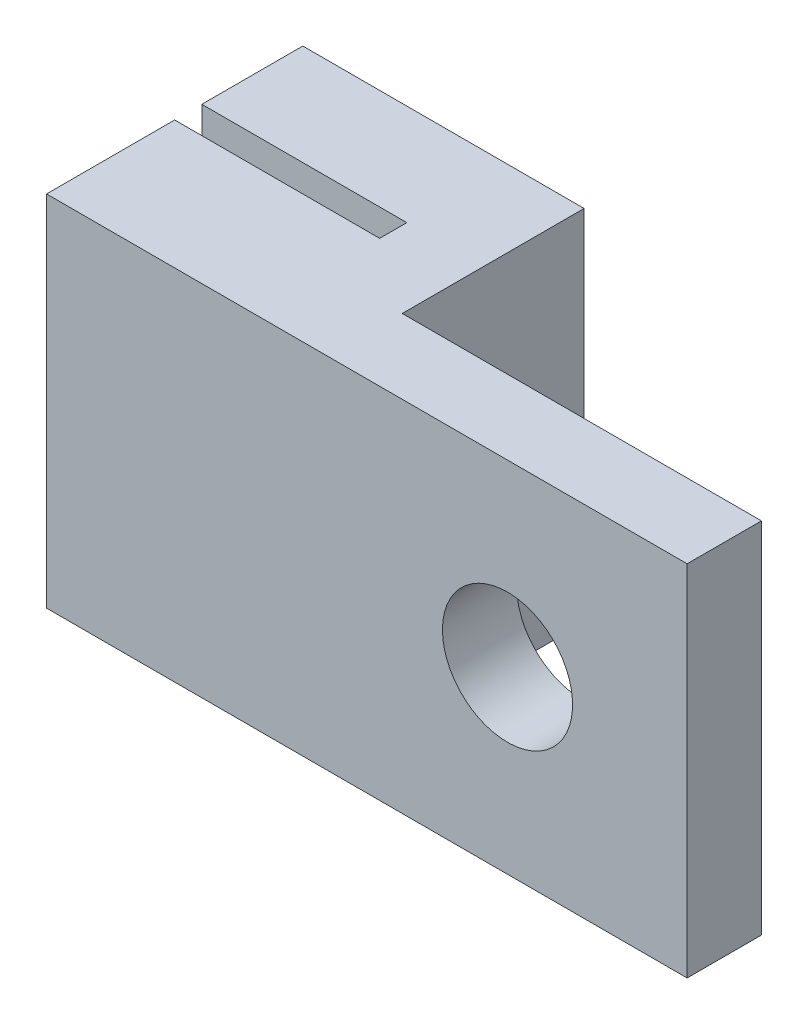
ISO-10303-21;
HEADER;
FILE_DESCRIPTION(('STEP AP214'),'2;1');
FILE_NAME('part.step','',(''),(''),'','','');
FILE_SCHEMA(('AUTOMOTIVE_DESIGN { 1 0 10303 214 1 1 1 1 }'));
ENDSEC;
DATA;
#1=APPLICATION_CONTEXT('core data for automotive mechanical design processes');
#2=APPLICATION_PROTOCOL_DEFINITION('international standard','automotive_design',2000,#1);
#3=PRODUCT_CONTEXT('',#1,'mechanical');
#4=PRODUCT('Part','Part','',(#3));
#5=PRODUCT_RELATED_PRODUCT_CATEGORY('part','',(#4));
#6=PRODUCT_DEFINITION_FORMATION('','',#4);
#7=PRODUCT_DEFINITION_CONTEXT('part definition',#1,'design');
#8=PRODUCT_DEFINITION('design','',#6,#7);
#9=PRODUCT_DEFINITION_SHAPE('','',#8);
#10=(LENGTH_UNIT() NAMED_UNIT(*) SI_UNIT(.MILLI.,.METRE.));
#11=(NAMED_UNIT(*) PLANE_ANGLE_UNIT() SI_UNIT($,.RADIAN.));
#12=(NAMED_UNIT(*) SI_UNIT($,.STERADIAN.) SOLID_ANGLE_UNIT());
#13=UNCERTAINTY_MEASURE_WITH_UNIT(LENGTH_MEASURE(1.E-05),#10,'distance_accuracy_value','');
#14=(GEOMETRIC_REPRESENTATION_CONTEXT(3) GLOBAL_UNCERTAINTY_ASSIGNED_CONTEXT((#13)) GLOBAL_UNIT_ASSIGNED_CONTEXT((#10,
#11,#12)) REPRESENTATION_CONTEXT('',''));
#15=CARTESIAN_POINT('',(0.,0.,0.));
#16=DIRECTION('',(0.,0.,1.));
#17=DIRECTION('',(1.,0.,0.));
#18=AXIS2_PLACEMENT_3D('',#15,#16,#17);
#19=CARTESIAN_POINT('',(0.,-14.,391.676417727354));
#20=DIRECTION('',(0.,0.,1.));
#21=DIRECTION('',(1.,0.,0.));
#22=AXIS2_PLACEMENT_3D('',#19,#20,#21);
#23=PLANE('',#22);
#24=DIRECTION('',(1.,0.,0.));
#25=VECTOR('',#24,1.);
#26=CARTESIAN_POINT('',(0.,0.,391.676417727354));
#27=LINE('',#26,#25);
#28=CARTESIAN_POINT('',(-1237.71012145749,0.,391.676417727354));
#29=VERTEX_POINT('',#28);
#30=CARTESIAN_POINT('',(-1229.71012145749,0.,391.676417727354));
#31=VERTEX_POINT('',#30);
#32=EDGE_CURVE('E142',#29,#31,#27,.T.);
#33=ORIENTED_EDGE('',*,*,#32,.F.);
#34=DIRECTION('',(0.,1.,0.));
#35=VECTOR('',#34,1.);
#36=CARTESIAN_POINT('',(-1237.71012145749,-14.,391.676417727354));
#37=LINE('',#36,#35);
#38=CARTESIAN_POINT('',(-1237.71012145749,-14.,391.676417727354));
#39=VERTEX_POINT('',#38);
#40=EDGE_CURVE('E11',#39,#29,#37,.T.);
#41=ORIENTED_EDGE('',*,*,#40,.F.);
#42=DIRECTION('',(1.,0.,0.));
#43=VECTOR('',#42,1.);
#44=CARTESIAN_POINT('',(0.,-14.,391.676417727354));
#45=LINE('',#44,#43);
#46=CARTESIAN_POINT('',(-1229.71012145749,-14.,391.676417727354));
#47=VERTEX_POINT('',#46);
#48=EDGE_CURVE('E171',#39,#47,#45,.T.);
#49=ORIENTED_EDGE('',*,*,#48,.T.);
#50=DIRECTION('',(0.,1.,0.));
#51=VECTOR('',#50,1.);
#52=CARTESIAN_POINT('',(-1229.71012145749,-14.,391.676417727354));
#53=LINE('',#52,#51);
#54=EDGE_CURVE('E36',#47,#31,#53,.T.);
#55=ORIENTED_EDGE('',*,*,#54,.T.);
#56=EDGE_LOOP('',(#33,#41,#49,#55));
#57=FACE_BOUND('',#56,.T.);
#58=ADVANCED_FACE('F33',(#57),#23,.T.);
#59=CARTESIAN_POINT('',(-1237.71012145749,-14.,0.));
#60=DIRECTION('',(1.,0.,0.));
#61=DIRECTION('',(0.,0.,-1.));
#62=AXIS2_PLACEMENT_3D('',#59,#60,#61);
#63=PLANE('',#62);
#64=DIRECTION('',(0.,0.,-1.));
#65=VECTOR('',#64,1.);
#66=CARTESIAN_POINT('',(-1237.71012145749,0.,0.));
#67=LINE('',#66,#65);
#68=CARTESIAN_POINT('',(-1237.71012145749,0.,387.736417727354));
#69=VERTEX_POINT('',#68);
#70=EDGE_CURVE('E155',#29,#69,#67,.T.);
#71=ORIENTED_EDGE('',*,*,#70,.T.);
#72=DIRECTION('',(0.,1.,0.));
#73=VECTOR('',#72,1.);
#74=CARTESIAN_POINT('',(-1237.71012145749,-14.,387.736417727354));
#75=LINE('',#74,#73);
#76=CARTESIAN_POINT('',(-1237.71012145749,-14.,387.736417727354));
#77=VERTEX_POINT('',#76);
#78=EDGE_CURVE('E41',#77,#69,#75,.T.);
#79=ORIENTED_EDGE('',*,*,#78,.F.);
#80=DIRECTION('',(0.,0.,-1.));
#81=VECTOR('',#80,1.);
#82=CARTESIAN_POINT('',(-1237.71012145749,-14.,0.));
#83=LINE('',#82,#81);
#84=EDGE_CURVE('E138',#39,#77,#83,.T.);
#85=ORIENTED_EDGE('',*,*,#84,.F.);
#86=ORIENTED_EDGE('',*,*,#40,.T.);
#87=EDGE_LOOP('',(#71,#79,#85,#86));
#88=FACE_BOUND('',#87,.T.);
#89=ADVANCED_FACE('F172',(#88),#63,.F.);
#90=CARTESIAN_POINT('',(0.,-14.,387.736417727354));
#91=DIRECTION('',(0.,0.,1.));
#92=DIRECTION('',(1.,0.,0.));
#93=AXIS2_PLACEMENT_3D('',#90,#91,#92);
#94=PLANE('',#93);
#95=DIRECTION('',(1.,0.,0.));
#96=VECTOR('',#95,1.);
#97=CARTESIAN_POINT('',(0.,0.,387.736417727354));
#98=LINE('',#97,#96);
#99=CARTESIAN_POINT('',(-1226.72982017208,0.,387.736417727354));
#100=VERTEX_POINT('',#99);
#101=EDGE_CURVE('E158',#69,#100,#98,.T.);
#102=ORIENTED_EDGE('',*,*,#101,.T.);
#103=DIRECTION('',(0.,1.,0.));
#104=VECTOR('',#103,1.);
#105=CARTESIAN_POINT('',(-1226.72982017208,-14.,387.736417727354));
#106=LINE('',#105,#104);
#107=CARTESIAN_POINT('',(-1226.72982017208,-14.,387.736417727354));
#108=VERTEX_POINT('',#107);
#109=EDGE_CURVE('E146',#108,#100,#106,.T.);
#110=ORIENTED_EDGE('',*,*,#109,.F.);
#111=DIRECTION('',(1.,0.,0.));
#112=VECTOR('',#111,1.);
#113=CARTESIAN_POINT('',(0.,-14.,387.736417727354));
#114=LINE('',#113,#112);
#115=EDGE_CURVE('E130',#77,#108,#114,.T.);
#116=ORIENTED_EDGE('',*,*,#115,.F.);
#117=ORIENTED_EDGE('',*,*,#78,.T.);
#118=EDGE_LOOP('',(#102,#110,#116,#117));
#119=FACE_BOUND('',#118,.T.);
#120=ADVANCED_FACE('F176',(#119),#94,.F.);
#121=CARTESIAN_POINT('',(-1212.71012145749,-14.,0.));
#122=DIRECTION('',(1.,0.,0.));
#123=DIRECTION('',(0.,0.,-1.));
#124=AXIS2_PLACEMENT_3D('',#121,#122,#123);
#125=PLANE('',#124);
#126=DIRECTION('',(0.,1.,0.));
#127=VECTOR('',#126,1.);
#128=CARTESIAN_POINT('',(-1212.71012145749,-14.,394.836001477778));
#129=LINE('',#128,#127);
#130=CARTESIAN_POINT('',(-1212.71012145749,-14.,394.836001477778));
#131=VERTEX_POINT('',#130);
#132=CARTESIAN_POINT('',(-1212.71012145749,0.,394.836001477778));
#133=VERTEX_POINT('',#132);
#134=EDGE_CURVE('E179',#131,#133,#129,.T.);
#135=ORIENTED_EDGE('',*,*,#134,.T.);
#136=DIRECTION('',(0.,0.,-1.));
#137=VECTOR('',#136,1.);
#138=CARTESIAN_POINT('',(-1212.71012145749,0.,0.));
#139=LINE('',#138,#137);
#140=CARTESIAN_POINT('',(-1212.71012145749,0.,397.736417727354));
#141=VERTEX_POINT('',#140);
#142=EDGE_CURVE('E114',#141,#133,#139,.T.);
#143=ORIENTED_EDGE('',*,*,#142,.F.);
#144=DIRECTION('',(0.,1.,0.));
#145=VECTOR('',#144,1.);
#146=CARTESIAN_POINT('',(-1212.71012145749,-14.,397.736417727354));
#147=LINE('',#146,#145);
#148=CARTESIAN_POINT('',(-1212.71012145749,-14.,397.736417727354));
#149=VERTEX_POINT('',#148);
#150=EDGE_CURVE('E107',#149,#141,#147,.T.);
#151=ORIENTED_EDGE('',*,*,#150,.F.);
#152=DIRECTION('',(0.,0.,-1.));
#153=VECTOR('',#152,1.);
#154=CARTESIAN_POINT('',(-1212.71012145749,-14.,0.));
#155=LINE('',#154,#153);
#156=EDGE_CURVE('E112',#149,#131,#155,.T.);
#157=ORIENTED_EDGE('',*,*,#156,.T.);
#158=EDGE_LOOP('',(#135,#143,#151,#157));
#159=FACE_BOUND('',#158,.T.);
#160=ADVANCED_FACE('F110',(#159),#125,.T.);
#161=CARTESIAN_POINT('',(0.,-14.,397.736417727354));
#162=DIRECTION('',(0.,0.,1.));
#163=DIRECTION('',(1.,0.,0.));
#164=AXIS2_PLACEMENT_3D('',#161,#162,#163);
#165=PLANE('',#164);
#166=CARTESIAN_POINT('',(-1219.71997081479,-7.,397.736417727354));
#167=DIRECTION('',(0.,0.,-1.));
#168=DIRECTION('',(-1.,0.,0.));
#169=AXIS2_PLACEMENT_3D('',#166,#167,#168);
#170=CIRCLE('',#169,2.54000000000006);
#171=CARTESIAN_POINT('',(-1222.25997081479,-7.,397.736417727354));
#172=VERTEX_POINT('',#171);
#173=EDGE_CURVE('E215',#172,#172,#170,.T.);
#174=ORIENTED_EDGE('',*,*,#173,.T.);
#175=EDGE_LOOP('',(#174));
#176=FACE_BOUND('',#175,.T.);
#177=DIRECTION('',(1.,0.,0.));
#178=VECTOR('',#177,1.);
#179=CARTESIAN_POINT('',(0.,0.,397.736417727354));
#180=LINE('',#179,#178);
#181=CARTESIAN_POINT('',(-1237.71012145749,0.,397.736417727354));
#182=VERTEX_POINT('',#181);
#183=EDGE_CURVE('E154',#182,#141,#180,.T.);
#184=ORIENTED_EDGE('',*,*,#183,.F.);
#185=DIRECTION('',(0.,1.,0.));
#186=VECTOR('',#185,1.);
#187=CARTESIAN_POINT('',(-1237.71012145749,-14.,397.736417727354));
#188=LINE('',#187,#186);
#189=CARTESIAN_POINT('',(-1237.71012145749,-14.,397.736417727354));
#190=VERTEX_POINT('',#189);
#191=EDGE_CURVE('E119',#190,#182,#188,.T.);
#192=ORIENTED_EDGE('',*,*,#191,.F.);
#193=DIRECTION('',(1.,0.,0.));
#194=VECTOR('',#193,1.);
#195=CARTESIAN_POINT('',(0.,-14.,397.736417727354));
#196=LINE('',#195,#194);
#197=EDGE_CURVE('E126',#190,#149,#196,.T.);
#198=ORIENTED_EDGE('',*,*,#197,.T.);
#199=ORIENTED_EDGE('',*,*,#150,.T.);
#200=EDGE_LOOP('',(#184,#192,#198,#199));
#201=FACE_BOUND('',#200,.T.);
#202=ADVANCED_FACE('F132',(#176,#201),#165,.T.);
#203=CARTESIAN_POINT('',(-1237.71012145749,0.,392.736417727354));
#204=VERTEX_POINT('',#203);
#205=EDGE_CURVE('E152',#182,#204,#67,.T.);
#206=ORIENTED_EDGE('',*,*,#205,.T.);
#207=DIRECTION('',(0.,1.,0.));
#208=VECTOR('',#207,1.);
#209=CARTESIAN_POINT('',(-1237.71012145749,-14.,392.736417727354));
#210=LINE('',#209,#208);
#211=CARTESIAN_POINT('',(-1237.71012145749,-14.,392.736417727354));
#212=VERTEX_POINT('',#211);
#213=EDGE_CURVE('E164',#212,#204,#210,.T.);
#214=ORIENTED_EDGE('',*,*,#213,.F.);
#215=EDGE_CURVE('E134',#190,#212,#83,.T.);
#216=ORIENTED_EDGE('',*,*,#215,.F.);
#217=ORIENTED_EDGE('',*,*,#191,.T.);
#218=EDGE_LOOP('',(#206,#214,#216,#217));
#219=FACE_BOUND('',#218,.T.);
#220=ADVANCED_FACE('F203',(#219),#63,.F.);
#221=CARTESIAN_POINT('',(0.,-14.,392.736417727354));
#222=DIRECTION('',(0.,0.,1.));
#223=DIRECTION('',(1.,0.,0.));
#224=AXIS2_PLACEMENT_3D('',#221,#222,#223);
#225=PLANE('',#224);
#226=DIRECTION('',(1.,0.,0.));
#227=VECTOR('',#226,1.);
#228=CARTESIAN_POINT('',(0.,0.,392.736417727354));
#229=LINE('',#228,#227);
#230=CARTESIAN_POINT('',(-1229.71012145749,0.,392.736417727354));
#231=VERTEX_POINT('',#230);
#232=EDGE_CURVE('E149',#204,#231,#229,.T.);
#233=ORIENTED_EDGE('',*,*,#232,.T.);
#234=DIRECTION('',(0.,1.,0.));
#235=VECTOR('',#234,1.);
#236=CARTESIAN_POINT('',(-1229.71012145749,-14.,392.736417727354));
#237=LINE('',#236,#235);
#238=CARTESIAN_POINT('',(-1229.71012145749,-14.,392.736417727354));
#239=VERTEX_POINT('',#238);
#240=EDGE_CURVE('E166',#239,#231,#237,.T.);
#241=ORIENTED_EDGE('',*,*,#240,.F.);
#242=DIRECTION('',(1.,0.,0.));
#243=VECTOR('',#242,1.);
#244=CARTESIAN_POINT('',(0.,-14.,392.736417727354));
#245=LINE('',#244,#243);
#246=EDGE_CURVE('E136',#212,#239,#245,.T.);
#247=ORIENTED_EDGE('',*,*,#246,.F.);
#248=ORIENTED_EDGE('',*,*,#213,.T.);
#249=EDGE_LOOP('',(#233,#241,#247,#248));
#250=FACE_BOUND('',#249,.T.);
#251=ADVANCED_FACE('F193',(#250),#225,.F.);
#252=CARTESIAN_POINT('',(-1229.71012145749,-14.,0.));
#253=DIRECTION('',(-1.,0.,0.));
#254=DIRECTION('',(0.,0.,1.));
#255=AXIS2_PLACEMENT_3D('',#252,#253,#254);
#256=PLANE('',#255);
#257=DIRECTION('',(0.,0.,1.));
#258=VECTOR('',#257,1.);
#259=CARTESIAN_POINT('',(-1229.71012145749,0.,0.));
#260=LINE('',#259,#258);
#261=EDGE_CURVE('E145',#31,#231,#260,.T.);
#262=ORIENTED_EDGE('',*,*,#261,.F.);
#263=ORIENTED_EDGE('',*,*,#54,.F.);
#264=DIRECTION('',(0.,0.,1.));
#265=VECTOR('',#264,1.);
#266=CARTESIAN_POINT('',(-1229.71012145749,-14.,0.));
#267=LINE('',#266,#265);
#268=EDGE_CURVE('E189',#47,#239,#267,.T.);
#269=ORIENTED_EDGE('',*,*,#268,.T.);
#270=ORIENTED_EDGE('',*,*,#240,.T.);
#271=EDGE_LOOP('',(#262,#263,#269,#270));
#272=FACE_BOUND('',#271,.T.);
#273=ADVANCED_FACE('F195',(#272),#256,.T.);
#274=CARTESIAN_POINT('',(0.,-14.,0.));
#275=DIRECTION('',(0.,1.,0.));
#276=DIRECTION('',(0.,0.,1.));
#277=AXIS2_PLACEMENT_3D('',#274,#275,#276);
#278=PLANE('',#277);
#279=ORIENTED_EDGE('',*,*,#115,.T.);
#280=DIRECTION('',(0.,0.,1.));
#281=VECTOR('',#280,1.);
#282=CARTESIAN_POINT('',(-1226.72982017208,-14.,387.736417727354));
#283=LINE('',#282,#281);
#284=CARTESIAN_POINT('',(-1226.72982017208,-14.,394.836001477778));
#285=VERTEX_POINT('',#284);
#286=EDGE_CURVE('E216',#108,#285,#283,.T.);
#287=ORIENTED_EDGE('',*,*,#286,.T.);
#288=DIRECTION('',(1.,0.,0.));
#289=VECTOR('',#288,1.);
#290=CARTESIAN_POINT('',(-1226.72982017208,-14.,394.836001477778));
#291=LINE('',#290,#289);
#292=EDGE_CURVE('E129',#285,#131,#291,.T.);
#293=ORIENTED_EDGE('',*,*,#292,.T.);
#294=ORIENTED_EDGE('',*,*,#156,.F.);
#295=ORIENTED_EDGE('',*,*,#197,.F.);
#296=ORIENTED_EDGE('',*,*,#215,.T.);
#297=ORIENTED_EDGE('',*,*,#246,.T.);
#298=ORIENTED_EDGE('',*,*,#268,.F.);
#299=ORIENTED_EDGE('',*,*,#48,.F.);
#300=ORIENTED_EDGE('',*,*,#84,.T.);
#301=EDGE_LOOP('',(#279,#287,#293,#294,#295,#296,#297,#298,#299,#300));
#302=FACE_BOUND('',#301,.T.);
#303=ADVANCED_FACE('F125',(#302),#278,.F.);
#304=CARTESIAN_POINT('',(0.,0.,0.));
#305=DIRECTION('',(0.,1.,0.));
#306=DIRECTION('',(0.,0.,1.));
#307=AXIS2_PLACEMENT_3D('',#304,#305,#306);
#308=PLANE('',#307);
#309=DIRECTION('',(0.,0.,1.));
#310=VECTOR('',#309,1.);
#311=CARTESIAN_POINT('',(-1226.72982017208,0.,387.736417727354));
#312=LINE('',#311,#310);
#313=CARTESIAN_POINT('',(-1226.72982017208,0.,394.836001477778));
#314=VERTEX_POINT('',#313);
#315=EDGE_CURVE('E49',#100,#314,#312,.T.);
#316=ORIENTED_EDGE('',*,*,#315,.F.);
#317=ORIENTED_EDGE('',*,*,#101,.F.);
#318=ORIENTED_EDGE('',*,*,#70,.F.);
#319=ORIENTED_EDGE('',*,*,#32,.T.);
#320=ORIENTED_EDGE('',*,*,#261,.T.);
#321=ORIENTED_EDGE('',*,*,#232,.F.);
#322=ORIENTED_EDGE('',*,*,#205,.F.);
#323=ORIENTED_EDGE('',*,*,#183,.T.);
#324=ORIENTED_EDGE('',*,*,#142,.T.);
#325=DIRECTION('',(1.,0.,0.));
#326=VECTOR('',#325,1.);
#327=CARTESIAN_POINT('',(-1226.72982017208,0.,394.836001477778));
#328=LINE('',#327,#326);
#329=EDGE_CURVE('E184',#314,#133,#328,.T.);
#330=ORIENTED_EDGE('',*,*,#329,.F.);
#331=EDGE_LOOP('',(#316,#317,#318,#319,#320,#321,#322,#323,#324,#330));
#332=FACE_BOUND('',#331,.T.);
#333=ADVANCED_FACE('F201',(#332),#308,.T.);
#334=CARTESIAN_POINT('',(-1226.72982017208,-14.,387.736417727354));
#335=DIRECTION('',(-1.,0.,0.));
#336=DIRECTION('',(0.,0.,1.));
#337=AXIS2_PLACEMENT_3D('',#334,#335,#336);
#338=PLANE('',#337);
#339=ORIENTED_EDGE('',*,*,#315,.T.);
#340=DIRECTION('',(0.,1.,0.));
#341=VECTOR('',#340,1.);
#342=CARTESIAN_POINT('',(-1226.72982017208,-14.,394.836001477778));
#343=LINE('',#342,#341);
#344=EDGE_CURVE('E181',#285,#314,#343,.T.);
#345=ORIENTED_EDGE('',*,*,#344,.F.);
#346=ORIENTED_EDGE('',*,*,#286,.F.);
#347=ORIENTED_EDGE('',*,*,#109,.T.);
#348=EDGE_LOOP('',(#339,#345,#346,#347));
#349=FACE_BOUND('',#348,.T.);
#350=ADVANCED_FACE('F231',(#349),#338,.F.);
#351=CARTESIAN_POINT('',(-1226.72982017208,-14.,394.836001477778));
#352=DIRECTION('',(0.,0.,1.));
#353=DIRECTION('',(1.,0.,0.));
#354=AXIS2_PLACEMENT_3D('',#351,#352,#353);
#355=PLANE('',#354);
#356=CARTESIAN_POINT('',(-1219.71997081479,-7.,394.836001477778));
#357=DIRECTION('',(0.,0.,-1.));
#358=DIRECTION('',(-1.,0.,0.));
#359=AXIS2_PLACEMENT_3D('',#356,#357,#358);
#360=CIRCLE('',#359,2.54000000000006);
#361=CARTESIAN_POINT('',(-1222.25997081479,-7.,394.836001477778));
#362=VERTEX_POINT('',#361);
#363=EDGE_CURVE('E218',#362,#362,#360,.T.);
#364=ORIENTED_EDGE('',*,*,#363,.F.);
#365=EDGE_LOOP('',(#364));
#366=FACE_BOUND('',#365,.T.);
#367=ORIENTED_EDGE('',*,*,#329,.T.);
#368=ORIENTED_EDGE('',*,*,#134,.F.);
#369=ORIENTED_EDGE('',*,*,#292,.F.);
#370=ORIENTED_EDGE('',*,*,#344,.T.);
#371=EDGE_LOOP('',(#367,#368,#369,#370));
#372=FACE_BOUND('',#371,.T.);
#373=ADVANCED_FACE('F228',(#366,#372),#355,.F.);
#374=CARTESIAN_POINT('',(-1219.71997081479,-7.,397.736417727354));
#375=DIRECTION('',(0.,0.,-1.));
#376=DIRECTION('',(-1.,0.,0.));
#377=AXIS2_PLACEMENT_3D('',#374,#375,#376);
#378=CYLINDRICAL_SURFACE('',#377,2.54000000000006);
#379=CARTESIAN_POINT('',(-1222.25997081479,-7.,397.736417727354));
#380=CARTESIAN_POINT('',(-1222.25997081479,-7.,397.706205058087));
#381=CARTESIAN_POINT('',(-1222.25997081479,-7.,397.675992388821));
#382=CARTESIAN_POINT('',(-1222.25997081479,-7.,397.615567050288));
#383=CARTESIAN_POINT('',(-1222.25997081479,-7.,397.585354381021));
#384=CARTESIAN_POINT('',(-1222.25997081479,-7.,397.524929042489));
#385=CARTESIAN_POINT('',(-1222.25997081479,-7.,397.494716373222));
#386=CARTESIAN_POINT('',(-1222.25997081479,-7.,397.434291034689));
#387=CARTESIAN_POINT('',(-1222.25997081479,-7.,397.404078365423));
#388=CARTESIAN_POINT('',(-1222.25997081479,-7.,397.34365302689));
#389=CARTESIAN_POINT('',(-1222.25997081479,-7.,397.313440357624));
#390=CARTESIAN_POINT('',(-1222.25997081479,-7.,397.253015019091));
#391=CARTESIAN_POINT('',(-1222.25997081479,-7.,397.222802349824));
#392=CARTESIAN_POINT('',(-1222.25997081479,-7.,397.162377011292));
#393=CARTESIAN_POINT('',(-1222.25997081479,-7.,397.132164342025));
#394=CARTESIAN_POINT('',(-1222.25997081479,-7.,397.071739003492));
#395=CARTESIAN_POINT('',(-1222.25997081479,-7.,397.041526334226));
#396=CARTESIAN_POINT('',(-1222.25997081479,-7.,396.981100995693));
#397=CARTESIAN_POINT('',(-1222.25997081479,-7.,396.950888326427));
#398=CARTESIAN_POINT('',(-1222.25997081479,-7.,396.890462987894));
#399=CARTESIAN_POINT('',(-1222.25997081479,-7.,396.860250318627));
#400=CARTESIAN_POINT('',(-1222.25997081479,-7.,396.799824980095));
#401=CARTESIAN_POINT('',(-1222.25997081479,-7.,396.769612310828));
#402=CARTESIAN_POINT('',(-1222.25997081479,-7.,396.709186972295));
#403=CARTESIAN_POINT('',(-1222.25997081479,-7.,396.678974303029));
#404=CARTESIAN_POINT('',(-1222.25997081479,-7.,396.618548964496));
#405=CARTESIAN_POINT('',(-1222.25997081479,-7.,396.58833629523));
#406=CARTESIAN_POINT('',(-1222.25997081479,-7.,396.527910956697));
#407=CARTESIAN_POINT('',(-1222.25997081479,-7.,396.49769828743));
#408=CARTESIAN_POINT('',(-1222.25997081479,-7.,396.437272948898));
#409=CARTESIAN_POINT('',(-1222.25997081479,-7.,396.407060279631));
#410=CARTESIAN_POINT('',(-1222.25997081479,-7.,396.346634941098));
#411=CARTESIAN_POINT('',(-1222.25997081479,-7.,396.316422271832));
#412=CARTESIAN_POINT('',(-1222.25997081479,-7.,396.255996933299));
#413=CARTESIAN_POINT('',(-1222.25997081479,-7.,396.225784264033));
#414=CARTESIAN_POINT('',(-1222.25997081479,-7.,396.1653589255));
#415=CARTESIAN_POINT('',(-1222.25997081479,-7.,396.135146256233));
#416=CARTESIAN_POINT('',(-1222.25997081479,-7.,396.074720917701));
#417=CARTESIAN_POINT('',(-1222.25997081479,-7.,396.044508248434));
#418=CARTESIAN_POINT('',(-1222.25997081479,-7.,395.984082909901));
#419=CARTESIAN_POINT('',(-1222.25997081479,-7.,395.953870240635));
#420=CARTESIAN_POINT('',(-1222.25997081479,-7.,395.893444902102));
#421=CARTESIAN_POINT('',(-1222.25997081479,-7.,395.863232232836));
#422=CARTESIAN_POINT('',(-1222.25997081479,-7.,395.802806894303));
#423=CARTESIAN_POINT('',(-1222.25997081479,-7.,395.772594225037));
#424=CARTESIAN_POINT('',(-1222.25997081479,-7.,395.712168886504));
#425=CARTESIAN_POINT('',(-1222.25997081479,-7.,395.681956217237));
#426=CARTESIAN_POINT('',(-1222.25997081479,-7.,395.621530878704));
#427=CARTESIAN_POINT('',(-1222.25997081479,-7.,395.591318209438));
#428=CARTESIAN_POINT('',(-1222.25997081479,-7.,395.530892870905));
#429=CARTESIAN_POINT('',(-1222.25997081479,-7.,395.500680201639));
#430=CARTESIAN_POINT('',(-1222.25997081479,-7.,395.440254863106));
#431=CARTESIAN_POINT('',(-1222.25997081479,-7.,395.41004219384));
#432=CARTESIAN_POINT('',(-1222.25997081479,-7.,395.349616855307));
#433=CARTESIAN_POINT('',(-1222.25997081479,-7.,395.31940418604));
#434=CARTESIAN_POINT('',(-1222.25997081479,-7.,395.258978847507));
#435=CARTESIAN_POINT('',(-1222.25997081479,-7.,395.228766178241));
#436=CARTESIAN_POINT('',(-1222.25997081479,-7.,395.168340839708));
#437=CARTESIAN_POINT('',(-1222.25997081479,-7.,395.138128170442));
#438=CARTESIAN_POINT('',(-1222.25997081479,-7.,395.077702831909));
#439=CARTESIAN_POINT('',(-1222.25997081479,-7.,395.047490162643));
#440=CARTESIAN_POINT('',(-1222.25997081479,-7.,394.98706482411));
#441=CARTESIAN_POINT('',(-1222.25997081479,-7.,394.956852154843));
#442=CARTESIAN_POINT('',(-1222.25997081479,-7.,394.89642681631));
#443=CARTESIAN_POINT('',(-1222.25997081479,-7.,394.866214147044));
#444=CARTESIAN_POINT('',(-1222.25997081479,-7.,394.836001477778));
#445=B_SPLINE_CURVE_WITH_KNOTS('',3,(#379,#380,#381,#382,#383,#384,#385,#386,#387,#388,#389,
#390,#391,#392,#393,#394,#395,#396,#397,#398,#399,#400,#401,#402,#403,#404,#405,#406,#407,#408,
#409,#410,#411,#412,#413,#414,#415,#416,#417,#418,#419,#420,#421,#422,#423,#424,#425,#426,#427,
#428,#429,#430,#431,#432,#433,#434,#435,#436,#437,#438,#439,#440,#441,#442,#443,#444),
.UNSPECIFIED.,.F.,.F.,(4,2,2,2,2,2,2,2,2,2,2,2,2,2,2,2,2,2,2,2,2,2,2,2,2,2,2,2,2,2,2,2,4),(0.,
0.090638007799293,0.18127601559853,0.271914023397768,0.362552031197005,0.453190038996243,
0.543828046795536,0.634466054594773,0.725104062394011,0.815742070193248,0.906380077992486,
0.997018085791779,1.08765609359102,1.17829410139025,1.26893210918949,1.35957011698873,
1.45020812478802,1.54084613258726,1.6314841403865,1.72212214818573,1.81276015598497,
1.90339816378421,1.9940361715835,2.08467417938274,2.17531218718198,2.26595019498121,
2.35658820278045,2.44722621057974,2.53786421837898,2.62850222617822,2.71914023397746,
2.80977824177669,2.90041624957599),.UNSPECIFIED.);
#446=EDGE_CURVE('BSEAM226',#172,#362,#445,.T.);
#447=ORIENTED_EDGE('',*,*,#173,.F.);
#448=ORIENTED_EDGE('',*,*,#363,.T.);
#449=ORIENTED_EDGE('',*,*,#446,.T.);
#450=ORIENTED_EDGE('',*,*,#446,.F.);
#451=EDGE_LOOP('',(#447,#449,#448,#450));
#452=FACE_BOUND('',#451,.T.);
#453=ADVANCED_FACE('F226',(#452),#378,.F.);
#454=CLOSED_SHELL('',(#58,#89,#120,#160,#202,#220,#251,#273,#303,#333,#350,#373,#453));
#455=MANIFOLD_SOLID_BREP('B2',#454);
#456=ADVANCED_BREP_SHAPE_REPRESENTATION('',(#18,#455),#14);
#457=SHAPE_DEFINITION_REPRESENTATION(#9,#456);
ENDSEC;
END-ISO-10303-21;
